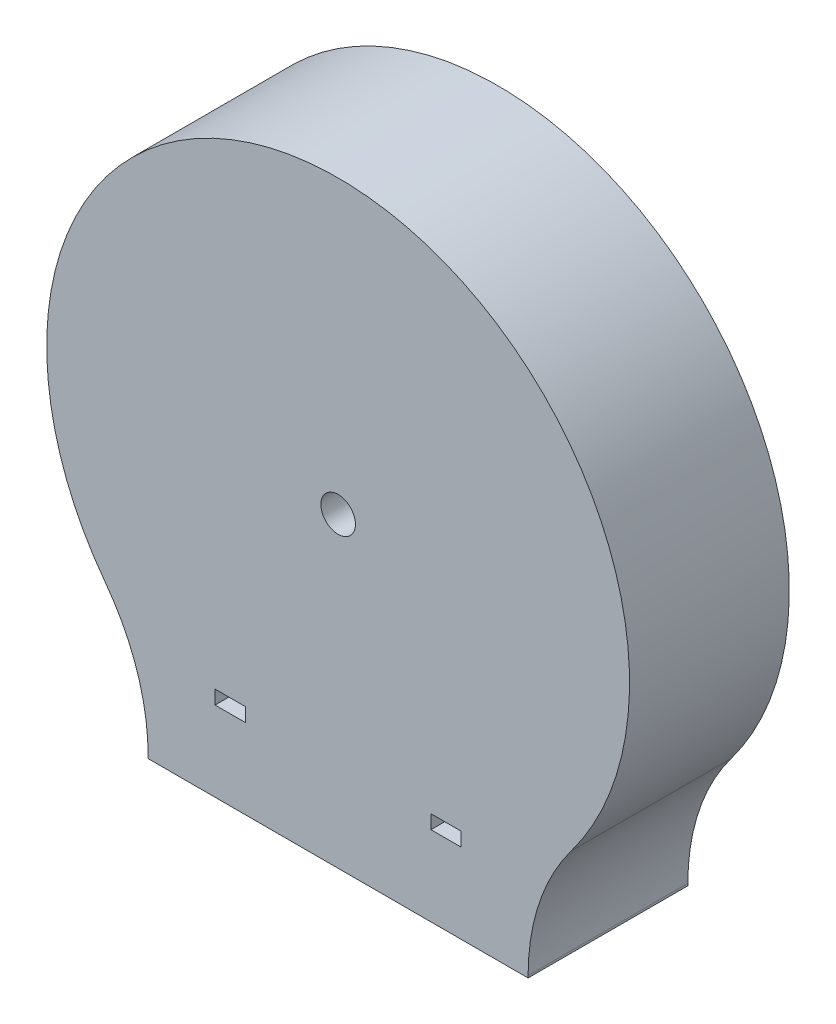
ISO-10303-21;
HEADER;
FILE_DESCRIPTION(('STEP AP214'),'2;1');
FILE_NAME('part.step','',(''),(''),'','','');
FILE_SCHEMA(('AUTOMOTIVE_DESIGN { 1 0 10303 214 1 1 1 1 }'));
ENDSEC;
DATA;
#1=APPLICATION_CONTEXT('core data for automotive mechanical design processes');
#2=APPLICATION_PROTOCOL_DEFINITION('international standard','automotive_design',2000,#1);
#3=PRODUCT_CONTEXT('',#1,'mechanical');
#4=PRODUCT('Part','Part','',(#3));
#5=PRODUCT_RELATED_PRODUCT_CATEGORY('part','',(#4));
#6=PRODUCT_DEFINITION_FORMATION('','',#4);
#7=PRODUCT_DEFINITION_CONTEXT('part definition',#1,'design');
#8=PRODUCT_DEFINITION('design','',#6,#7);
#9=PRODUCT_DEFINITION_SHAPE('','',#8);
#10=(LENGTH_UNIT() NAMED_UNIT(*) SI_UNIT(.MILLI.,.METRE.));
#11=(NAMED_UNIT(*) PLANE_ANGLE_UNIT() SI_UNIT($,.RADIAN.));
#12=(NAMED_UNIT(*) SI_UNIT($,.STERADIAN.) SOLID_ANGLE_UNIT());
#13=UNCERTAINTY_MEASURE_WITH_UNIT(LENGTH_MEASURE(1.E-05),#10,'distance_accuracy_value','');
#14=(GEOMETRIC_REPRESENTATION_CONTEXT(3) GLOBAL_UNCERTAINTY_ASSIGNED_CONTEXT((#13)) GLOBAL_UNIT_ASSIGNED_CONTEXT((#10,
#11,#12)) REPRESENTATION_CONTEXT('',''));
#15=CARTESIAN_POINT('',(0.,0.,0.));
#16=DIRECTION('',(0.,0.,1.));
#17=DIRECTION('',(1.,0.,0.));
#18=AXIS2_PLACEMENT_3D('',#15,#16,#17);
#19=CARTESIAN_POINT('',(-44.,-51.1883775871047,-37.));
#20=DIRECTION('',(-1.,0.,0.));
#21=DIRECTION('',(0.,0.,1.));
#22=AXIS2_PLACEMENT_3D('',#19,#20,#21);
#23=PLANE('',#22);
#24=DIRECTION('',(0.,-1.,0.));
#25=VECTOR('',#24,1.);
#26=CARTESIAN_POINT('',(-44.,-51.1883775871047,0.));
#27=LINE('',#26,#25);
#28=CARTESIAN_POINT('',(-44.,-70.5,0.));
#29=VERTEX_POINT('',#28);
#30=CARTESIAN_POINT('',(-44.,-71.,0.));
#31=VERTEX_POINT('',#30);
#32=EDGE_CURVE('E266',#29,#31,#27,.T.);
#33=ORIENTED_EDGE('',*,*,#32,.F.);
#34=DIRECTION('',(0.,0.,-1.));
#35=VECTOR('',#34,1.);
#36=CARTESIAN_POINT('',(-44.,-70.5,-37.));
#37=LINE('',#36,#35);
#38=CARTESIAN_POINT('',(-44.,-70.5,-37.));
#39=VERTEX_POINT('',#38);
#40=EDGE_CURVE('E298',#29,#39,#37,.T.);
#41=ORIENTED_EDGE('',*,*,#40,.T.);
#42=DIRECTION('',(0.,-1.,0.));
#43=VECTOR('',#42,1.);
#44=CARTESIAN_POINT('',(-44.,-51.1883775871047,-37.));
#45=LINE('',#44,#43);
#46=CARTESIAN_POINT('',(-44.,-71.,-37.));
#47=VERTEX_POINT('',#46);
#48=EDGE_CURVE('E267',#39,#47,#45,.T.);
#49=ORIENTED_EDGE('',*,*,#48,.T.);
#50=DIRECTION('',(0.,0.,1.));
#51=VECTOR('',#50,1.);
#52=CARTESIAN_POINT('',(-44.,-71.,-37.));
#53=LINE('',#52,#51);
#54=EDGE_CURVE('E279',#47,#31,#53,.T.);
#55=ORIENTED_EDGE('',*,*,#54,.T.);
#56=EDGE_LOOP('',(#33,#41,#49,#55));
#57=FACE_BOUND('',#56,.T.);
#58=ADVANCED_FACE('F17',(#57),#23,.T.);
#59=CARTESIAN_POINT('',(0.,0.,-37.));
#60=DIRECTION('',(0.,0.,1.));
#61=DIRECTION('',(1.,0.,0.));
#62=AXIS2_PLACEMENT_3D('',#59,#60,#61);
#63=CYLINDRICAL_SURFACE('',#62,67.5);
#64=CARTESIAN_POINT('',(0.,0.,-37.));
#65=DIRECTION('',(0.,0.,1.));
#66=DIRECTION('',(1.,0.,0.));
#67=AXIS2_PLACEMENT_3D('',#64,#65,#66);
#68=CIRCLE('',#67,67.5);
#69=CARTESIAN_POINT('',(54.,-40.5,-37.));
#70=VERTEX_POINT('',#69);
#71=CARTESIAN_POINT('',(-54.,-40.5,-37.));
#72=VERTEX_POINT('',#71);
#73=EDGE_CURVE('E276',#70,#72,#68,.T.);
#74=ORIENTED_EDGE('',*,*,#73,.T.);
#75=DIRECTION('',(0.,0.,1.));
#76=VECTOR('',#75,1.);
#77=CARTESIAN_POINT('',(-54.,-40.5,-37.));
#78=LINE('',#77,#76);
#79=CARTESIAN_POINT('',(-54.,-40.5,0.));
#80=VERTEX_POINT('',#79);
#81=EDGE_CURVE('E295',#72,#80,#78,.T.);
#82=ORIENTED_EDGE('',*,*,#81,.T.);
#83=CARTESIAN_POINT('',(0.,0.,0.));
#84=DIRECTION('',(0.,0.,1.));
#85=DIRECTION('',(1.,0.,0.));
#86=AXIS2_PLACEMENT_3D('',#83,#84,#85);
#87=CIRCLE('',#86,67.5);
#88=CARTESIAN_POINT('',(54.,-40.5,0.));
#89=VERTEX_POINT('',#88);
#90=EDGE_CURVE('E270',#89,#80,#87,.T.);
#91=ORIENTED_EDGE('',*,*,#90,.F.);
#92=DIRECTION('',(0.,0.,1.));
#93=VECTOR('',#92,1.);
#94=CARTESIAN_POINT('',(54.,-40.5,-37.));
#95=LINE('',#94,#93);
#96=EDGE_CURVE('E291',#89,#70,#95,.F.);
#97=ORIENTED_EDGE('',*,*,#96,.T.);
#98=EDGE_LOOP('',(#74,#82,#91,#97));
#99=FACE_BOUND('',#98,.T.);
#100=ADVANCED_FACE('F347',(#99),#63,.T.);
#101=CARTESIAN_POINT('',(44.,-71.,-37.));
#102=DIRECTION('',(1.,0.,0.));
#103=DIRECTION('',(0.,0.,-1.));
#104=AXIS2_PLACEMENT_3D('',#101,#102,#103);
#105=PLANE('',#104);
#106=DIRECTION('',(0.,1.,0.));
#107=VECTOR('',#106,1.);
#108=CARTESIAN_POINT('',(44.,-71.,-37.));
#109=LINE('',#108,#107);
#110=CARTESIAN_POINT('',(44.,-71.,-37.));
#111=VERTEX_POINT('',#110);
#112=CARTESIAN_POINT('',(44.,-70.5,-37.));
#113=VERTEX_POINT('',#112);
#114=EDGE_CURVE('E273',#111,#113,#109,.T.);
#115=ORIENTED_EDGE('',*,*,#114,.T.);
#116=DIRECTION('',(0.,0.,-1.));
#117=VECTOR('',#116,1.);
#118=CARTESIAN_POINT('',(44.,-70.5,0.));
#119=LINE('',#118,#117);
#120=CARTESIAN_POINT('',(44.,-70.5,0.));
#121=VERTEX_POINT('',#120);
#122=EDGE_CURVE('E300',#113,#121,#119,.F.);
#123=ORIENTED_EDGE('',*,*,#122,.T.);
#124=DIRECTION('',(0.,1.,0.));
#125=VECTOR('',#124,1.);
#126=CARTESIAN_POINT('',(44.,-71.,0.));
#127=LINE('',#126,#125);
#128=CARTESIAN_POINT('',(44.,-71.,0.));
#129=VERTEX_POINT('',#128);
#130=EDGE_CURVE('E284',#129,#121,#127,.T.);
#131=ORIENTED_EDGE('',*,*,#130,.F.);
#132=DIRECTION('',(0.,0.,1.));
#133=VECTOR('',#132,1.);
#134=CARTESIAN_POINT('',(44.,-71.,-37.));
#135=LINE('',#134,#133);
#136=EDGE_CURVE('E289',#111,#129,#135,.T.);
#137=ORIENTED_EDGE('',*,*,#136,.F.);
#138=EDGE_LOOP('',(#115,#123,#131,#137));
#139=FACE_BOUND('',#138,.T.);
#140=ADVANCED_FACE('F354',(#139),#105,.T.);
#141=CARTESIAN_POINT('',(-44.,-71.,-37.));
#142=DIRECTION('',(0.,-1.,0.));
#143=DIRECTION('',(1.,0.,0.));
#144=AXIS2_PLACEMENT_3D('',#141,#142,#143);
#145=PLANE('',#144);
#146=CARTESIAN_POINT('',(25.,-71.,-18.5));
#147=DIRECTION('',(0.,-1.,0.));
#148=DIRECTION('',(1.,0.,0.));
#149=AXIS2_PLACEMENT_3D('',#146,#147,#148);
#150=CIRCLE('',#149,2.35);
#151=CARTESIAN_POINT('',(27.35,-71.,-18.5));
#152=VERTEX_POINT('',#151);
#153=EDGE_CURVE('E227',#152,#152,#150,.T.);
#154=ORIENTED_EDGE('',*,*,#153,.F.);
#155=EDGE_LOOP('',(#154));
#156=FACE_BOUND('',#155,.T.);
#157=CARTESIAN_POINT('',(-25.,-71.,-18.5));
#158=DIRECTION('',(0.,-1.,0.));
#159=DIRECTION('',(1.,0.,0.));
#160=AXIS2_PLACEMENT_3D('',#157,#158,#159);
#161=CIRCLE('',#160,2.35);
#162=CARTESIAN_POINT('',(-22.65,-71.,-18.5));
#163=VERTEX_POINT('',#162);
#164=EDGE_CURVE('E234',#163,#163,#161,.T.);
#165=ORIENTED_EDGE('',*,*,#164,.F.);
#166=EDGE_LOOP('',(#165));
#167=FACE_BOUND('',#166,.T.);
#168=DIRECTION('',(1.,0.,0.));
#169=VECTOR('',#168,1.);
#170=CARTESIAN_POINT('',(-44.,-71.,0.));
#171=LINE('',#170,#169);
#172=EDGE_CURVE('E281',#31,#129,#171,.T.);
#173=ORIENTED_EDGE('',*,*,#172,.F.);
#174=ORIENTED_EDGE('',*,*,#54,.F.);
#175=DIRECTION('',(1.,0.,0.));
#176=VECTOR('',#175,1.);
#177=CARTESIAN_POINT('',(-44.,-71.,-37.));
#178=LINE('',#177,#176);
#179=EDGE_CURVE('E269',#47,#111,#178,.T.);
#180=ORIENTED_EDGE('',*,*,#179,.T.);
#181=ORIENTED_EDGE('',*,*,#136,.T.);
#182=EDGE_LOOP('',(#173,#174,#180,#181));
#183=FACE_BOUND('',#182,.T.);
#184=ADVANCED_FACE('F359',(#156,#167,#183),#145,.T.);
#185=CARTESIAN_POINT('',(0.,0.,-37.));
#186=DIRECTION('',(0.,0.,1.));
#187=DIRECTION('',(1.,0.,0.));
#188=AXIS2_PLACEMENT_3D('',#185,#186,#187);
#189=PLANE('',#188);
#190=CARTESIAN_POINT('',(-26.7342042148256,15.435,-37.));
#191=DIRECTION('',(0.,0.,-1.));
#192=DIRECTION('',(-1.,0.,0.));
#193=AXIS2_PLACEMENT_3D('',#190,#191,#192);
#194=CIRCLE('',#193,3.99999999999999);
#195=CARTESIAN_POINT('',(-30.7342042148256,15.435,-37.));
#196=VERTEX_POINT('',#195);
#197=EDGE_CURVE('E182',#196,#196,#194,.T.);
#198=ORIENTED_EDGE('',*,*,#197,.F.);
#199=EDGE_LOOP('',(#198));
#200=FACE_BOUND('',#199,.T.);
#201=CARTESIAN_POINT('',(-26.7342042148256,-15.435,-37.));
#202=DIRECTION('',(0.,0.,-1.));
#203=DIRECTION('',(-1.,0.,0.));
#204=AXIS2_PLACEMENT_3D('',#201,#202,#203);
#205=CIRCLE('',#204,4.);
#206=CARTESIAN_POINT('',(-30.7342042148256,-15.435,-37.));
#207=VERTEX_POINT('',#206);
#208=EDGE_CURVE('E198',#207,#207,#205,.T.);
#209=ORIENTED_EDGE('',*,*,#208,.F.);
#210=EDGE_LOOP('',(#209));
#211=FACE_BOUND('',#210,.T.);
#212=CARTESIAN_POINT('',(0.,-30.87,-37.));
#213=DIRECTION('',(0.,0.,-1.));
#214=DIRECTION('',(-1.,0.,0.));
#215=AXIS2_PLACEMENT_3D('',#212,#213,#214);
#216=CIRCLE('',#215,4.);
#217=CARTESIAN_POINT('',(-4.,-30.87,-37.));
#218=VERTEX_POINT('',#217);
#219=EDGE_CURVE('E192',#218,#218,#216,.T.);
#220=ORIENTED_EDGE('',*,*,#219,.F.);
#221=EDGE_LOOP('',(#220));
#222=FACE_BOUND('',#221,.T.);
#223=CARTESIAN_POINT('',(26.7342042148256,-15.435,-37.));
#224=DIRECTION('',(0.,0.,-1.));
#225=DIRECTION('',(-1.,0.,0.));
#226=AXIS2_PLACEMENT_3D('',#223,#224,#225);
#227=CIRCLE('',#226,4.);
#228=CARTESIAN_POINT('',(22.7342042148256,-15.435,-37.));
#229=VERTEX_POINT('',#228);
#230=EDGE_CURVE('E191',#229,#229,#227,.T.);
#231=ORIENTED_EDGE('',*,*,#230,.F.);
#232=EDGE_LOOP('',(#231));
#233=FACE_BOUND('',#232,.T.);
#234=CARTESIAN_POINT('',(26.7342042148256,15.435,-37.));
#235=DIRECTION('',(0.,0.,-1.));
#236=DIRECTION('',(-1.,0.,0.));
#237=AXIS2_PLACEMENT_3D('',#234,#235,#236);
#238=CIRCLE('',#237,4.);
#239=CARTESIAN_POINT('',(22.7342042148256,15.435,-37.));
#240=VERTEX_POINT('',#239);
#241=EDGE_CURVE('E216',#240,#240,#238,.T.);
#242=ORIENTED_EDGE('',*,*,#241,.F.);
#243=EDGE_LOOP('',(#242));
#244=FACE_BOUND('',#243,.T.);
#245=CARTESIAN_POINT('',(0.,30.87,-37.));
#246=DIRECTION('',(0.,0.,-1.));
#247=DIRECTION('',(-1.,0.,0.));
#248=AXIS2_PLACEMENT_3D('',#245,#246,#247);
#249=CIRCLE('',#248,4.);
#250=CARTESIAN_POINT('',(-4.,30.87,-37.));
#251=VERTEX_POINT('',#250);
#252=EDGE_CURVE('E210',#251,#251,#249,.T.);
#253=ORIENTED_EDGE('',*,*,#252,.F.);
#254=EDGE_LOOP('',(#253));
#255=FACE_BOUND('',#254,.T.);
#256=CARTESIAN_POINT('',(0.,0.,-37.));
#257=DIRECTION('',(0.,0.,-1.));
#258=DIRECTION('',(-1.,0.,0.));
#259=AXIS2_PLACEMENT_3D('',#256,#257,#258);
#260=CIRCLE('',#259,4.);
#261=CARTESIAN_POINT('',(-4.,0.,-37.));
#262=VERTEX_POINT('',#261);
#263=EDGE_CURVE('E228',#262,#262,#260,.T.);
#264=ORIENTED_EDGE('',*,*,#263,.F.);
#265=EDGE_LOOP('',(#264));
#266=FACE_BOUND('',#265,.T.);
#267=ORIENTED_EDGE('',*,*,#48,.F.);
#268=CARTESIAN_POINT('',(-94.,-70.5,-37.));
#269=DIRECTION('',(0.,0.,1.));
#270=DIRECTION('',(1.,0.,0.));
#271=AXIS2_PLACEMENT_3D('',#268,#269,#270);
#272=CIRCLE('',#271,50.);
#273=EDGE_CURVE('E305',#39,#72,#272,.T.);
#274=ORIENTED_EDGE('',*,*,#273,.T.);
#275=ORIENTED_EDGE('',*,*,#73,.F.);
#276=CARTESIAN_POINT('',(94.,-70.5,-37.));
#277=DIRECTION('',(0.,0.,1.));
#278=DIRECTION('',(1.,0.,0.));
#279=AXIS2_PLACEMENT_3D('',#276,#277,#278);
#280=CIRCLE('',#279,50.);
#281=EDGE_CURVE('E11',#70,#113,#280,.T.);
#282=ORIENTED_EDGE('',*,*,#281,.T.);
#283=ORIENTED_EDGE('',*,*,#114,.F.);
#284=ORIENTED_EDGE('',*,*,#179,.F.);
#285=EDGE_LOOP('',(#267,#274,#275,#282,#283,#284));
#286=FACE_BOUND('',#285,.T.);
#287=ADVANCED_FACE('F372',(#200,#211,#222,#233,#244,#255,#266,#286),#189,.F.);
#288=CARTESIAN_POINT('',(0.,0.,0.));
#289=DIRECTION('',(0.,0.,1.));
#290=DIRECTION('',(1.,0.,0.));
#291=AXIS2_PLACEMENT_3D('',#288,#289,#290);
#292=PLANE('',#291);
#293=DIRECTION('',(0.,-1.,0.));
#294=VECTOR('',#293,1.);
#295=CARTESIAN_POINT('',(21.5,-52.5,0.));
#296=LINE('',#295,#294);
#297=CARTESIAN_POINT('',(21.5,-49.3,0.));
#298=VERTEX_POINT('',#297);
#299=CARTESIAN_POINT('',(21.5,-52.5,0.));
#300=VERTEX_POINT('',#299);
#301=EDGE_CURVE('E34',#298,#300,#296,.T.);
#302=ORIENTED_EDGE('',*,*,#301,.F.);
#303=DIRECTION('',(-1.,0.,0.));
#304=VECTOR('',#303,1.);
#305=CARTESIAN_POINT('',(21.5,-49.3,0.));
#306=LINE('',#305,#304);
#307=CARTESIAN_POINT('',(28.5,-49.3,0.));
#308=VERTEX_POINT('',#307);
#309=EDGE_CURVE('E139',#308,#298,#306,.T.);
#310=ORIENTED_EDGE('',*,*,#309,.F.);
#311=DIRECTION('',(0.,1.,0.));
#312=VECTOR('',#311,1.);
#313=CARTESIAN_POINT('',(28.5,-52.5,0.));
#314=LINE('',#313,#312);
#315=CARTESIAN_POINT('',(28.5,-52.5,0.));
#316=VERTEX_POINT('',#315);
#317=EDGE_CURVE('E142',#316,#308,#314,.T.);
#318=ORIENTED_EDGE('',*,*,#317,.F.);
#319=DIRECTION('',(1.,0.,0.));
#320=VECTOR('',#319,1.);
#321=CARTESIAN_POINT('',(21.5,-52.5,0.));
#322=LINE('',#321,#320);
#323=EDGE_CURVE('E148',#300,#316,#322,.T.);
#324=ORIENTED_EDGE('',*,*,#323,.F.);
#325=EDGE_LOOP('',(#302,#310,#318,#324));
#326=FACE_BOUND('',#325,.T.);
#327=DIRECTION('',(0.,-1.,0.));
#328=VECTOR('',#327,1.);
#329=CARTESIAN_POINT('',(-28.5,-52.5,0.));
#330=LINE('',#329,#328);
#331=CARTESIAN_POINT('',(-28.5,-49.3,0.));
#332=VERTEX_POINT('',#331);
#333=CARTESIAN_POINT('',(-28.5,-52.5,0.));
#334=VERTEX_POINT('',#333);
#335=EDGE_CURVE('E42',#332,#334,#330,.T.);
#336=ORIENTED_EDGE('',*,*,#335,.F.);
#337=DIRECTION('',(-1.,0.,0.));
#338=VECTOR('',#337,1.);
#339=CARTESIAN_POINT('',(-28.5,-49.3,0.));
#340=LINE('',#339,#338);
#341=CARTESIAN_POINT('',(-21.5,-49.3,0.));
#342=VERTEX_POINT('',#341);
#343=EDGE_CURVE('E161',#342,#332,#340,.T.);
#344=ORIENTED_EDGE('',*,*,#343,.F.);
#345=DIRECTION('',(0.,1.,0.));
#346=VECTOR('',#345,1.);
#347=CARTESIAN_POINT('',(-21.5,-52.5,0.));
#348=LINE('',#347,#346);
#349=CARTESIAN_POINT('',(-21.5,-52.5,0.));
#350=VERTEX_POINT('',#349);
#351=EDGE_CURVE('E175',#350,#342,#348,.T.);
#352=ORIENTED_EDGE('',*,*,#351,.F.);
#353=DIRECTION('',(1.,0.,0.));
#354=VECTOR('',#353,1.);
#355=CARTESIAN_POINT('',(-28.5,-52.5,0.));
#356=LINE('',#355,#354);
#357=EDGE_CURVE('E172',#334,#350,#356,.T.);
#358=ORIENTED_EDGE('',*,*,#357,.F.);
#359=EDGE_LOOP('',(#336,#344,#352,#358));
#360=FACE_BOUND('',#359,.T.);
#361=CARTESIAN_POINT('',(0.,0.,0.));
#362=DIRECTION('',(0.,0.,1.));
#363=DIRECTION('',(1.,0.,0.));
#364=AXIS2_PLACEMENT_3D('',#361,#362,#363);
#365=CIRCLE('',#364,4.);
#366=CARTESIAN_POINT('',(4.,0.,0.));
#367=VERTEX_POINT('',#366);
#368=EDGE_CURVE('E240',#367,#367,#365,.T.);
#369=ORIENTED_EDGE('',*,*,#368,.F.);
#370=EDGE_LOOP('',(#369));
#371=FACE_BOUND('',#370,.T.);
#372=ORIENTED_EDGE('',*,*,#90,.T.);
#373=CARTESIAN_POINT('',(-94.,-70.5,0.));
#374=DIRECTION('',(0.,0.,1.));
#375=DIRECTION('',(1.,0.,0.));
#376=AXIS2_PLACEMENT_3D('',#373,#374,#375);
#377=CIRCLE('',#376,50.);
#378=EDGE_CURVE('E303',#80,#29,#377,.F.);
#379=ORIENTED_EDGE('',*,*,#378,.T.);
#380=ORIENTED_EDGE('',*,*,#32,.T.);
#381=ORIENTED_EDGE('',*,*,#172,.T.);
#382=ORIENTED_EDGE('',*,*,#130,.T.);
#383=CARTESIAN_POINT('',(94.,-70.5,0.));
#384=DIRECTION('',(0.,0.,1.));
#385=DIRECTION('',(1.,0.,0.));
#386=AXIS2_PLACEMENT_3D('',#383,#384,#385);
#387=CIRCLE('',#386,50.);
#388=EDGE_CURVE('E26',#121,#89,#387,.F.);
#389=ORIENTED_EDGE('',*,*,#388,.T.);
#390=EDGE_LOOP('',(#372,#379,#380,#381,#382,#389));
#391=FACE_BOUND('',#390,.T.);
#392=ADVANCED_FACE('F363',(#326,#360,#371,#391),#292,.T.);
#393=CARTESIAN_POINT('',(-94.,-70.5,-37.));
#394=DIRECTION('',(0.,0.,1.));
#395=DIRECTION('',(1.,0.,0.));
#396=AXIS2_PLACEMENT_3D('',#393,#394,#395);
#397=CYLINDRICAL_SURFACE('',#396,50.);
#398=ORIENTED_EDGE('',*,*,#273,.F.);
#399=ORIENTED_EDGE('',*,*,#40,.F.);
#400=ORIENTED_EDGE('',*,*,#378,.F.);
#401=ORIENTED_EDGE('',*,*,#81,.F.);
#402=EDGE_LOOP('',(#398,#399,#400,#401));
#403=FACE_BOUND('',#402,.T.);
#404=ADVANCED_FACE('F361',(#403),#397,.F.);
#405=CARTESIAN_POINT('',(94.,-70.5,-37.));
#406=DIRECTION('',(0.,0.,1.));
#407=DIRECTION('',(1.,0.,0.));
#408=AXIS2_PLACEMENT_3D('',#405,#406,#407);
#409=CYLINDRICAL_SURFACE('',#408,50.);
#410=ORIENTED_EDGE('',*,*,#281,.F.);
#411=ORIENTED_EDGE('',*,*,#96,.F.);
#412=ORIENTED_EDGE('',*,*,#388,.F.);
#413=ORIENTED_EDGE('',*,*,#122,.F.);
#414=EDGE_LOOP('',(#410,#411,#412,#413));
#415=FACE_BOUND('',#414,.T.);
#416=ADVANCED_FACE('F19',(#415),#409,.F.);
#417=CARTESIAN_POINT('',(0.,0.,-13.5));
#418=DIRECTION('',(0.,0.,1.));
#419=DIRECTION('',(1.,0.,0.));
#420=AXIS2_PLACEMENT_3D('',#417,#418,#419);
#421=CYLINDRICAL_SURFACE('',#420,4.);
#422=CARTESIAN_POINT('',(0.,0.,-13.5));
#423=DIRECTION('',(0.,0.,1.));
#424=DIRECTION('',(1.,0.,0.));
#425=AXIS2_PLACEMENT_3D('',#422,#423,#424);
#426=CIRCLE('',#425,4.);
#427=CARTESIAN_POINT('',(4.,0.,-13.5));
#428=VERTEX_POINT('',#427);
#429=EDGE_CURVE('E243',#428,#428,#426,.T.);
#430=ORIENTED_EDGE('',*,*,#429,.F.);
#431=EDGE_LOOP('',(#430));
#432=FACE_BOUND('',#431,.T.);
#433=ORIENTED_EDGE('',*,*,#368,.T.);
#434=EDGE_LOOP('',(#433));
#435=FACE_BOUND('',#434,.T.);
#436=ADVANCED_FACE('F370',(#432,#435),#421,.F.);
#437=CARTESIAN_POINT('',(0.,0.,-13.5));
#438=DIRECTION('',(0.,0.,1.));
#439=DIRECTION('',(1.,0.,0.));
#440=AXIS2_PLACEMENT_3D('',#437,#438,#439);
#441=PLANE('',#440);
#442=ORIENTED_EDGE('',*,*,#429,.T.);
#443=EDGE_LOOP('',(#442));
#444=FACE_BOUND('',#443,.T.);
#445=ADVANCED_FACE('F408',(#444),#441,.T.);
#446=CARTESIAN_POINT('',(-25.,-39.6,-18.5));
#447=DIRECTION('',(0.,-1.,0.));
#448=DIRECTION('',(1.,0.,0.));
#449=AXIS2_PLACEMENT_3D('',#446,#447,#448);
#450=CYLINDRICAL_SURFACE('',#449,2.35);
#451=CARTESIAN_POINT('',(-25.,-39.6,-18.5));
#452=DIRECTION('',(0.,-1.,0.));
#453=DIRECTION('',(1.,0.,0.));
#454=AXIS2_PLACEMENT_3D('',#451,#452,#453);
#455=CIRCLE('',#454,2.35);
#456=CARTESIAN_POINT('',(-22.65,-39.6,-18.5));
#457=VERTEX_POINT('',#456);
#458=EDGE_CURVE('E237',#457,#457,#455,.T.);
#459=ORIENTED_EDGE('',*,*,#458,.F.);
#460=EDGE_LOOP('',(#459));
#461=FACE_BOUND('',#460,.T.);
#462=ORIENTED_EDGE('',*,*,#164,.T.);
#463=EDGE_LOOP('',(#462));
#464=FACE_BOUND('',#463,.T.);
#465=ADVANCED_FACE('F405',(#461,#464),#450,.F.);
#466=CARTESIAN_POINT('',(-25.,-39.6,-18.5));
#467=DIRECTION('',(0.,-1.,0.));
#468=DIRECTION('',(1.,0.,0.));
#469=AXIS2_PLACEMENT_3D('',#466,#467,#468);
#470=PLANE('',#469);
#471=ORIENTED_EDGE('',*,*,#458,.T.);
#472=EDGE_LOOP('',(#471));
#473=FACE_BOUND('',#472,.T.);
#474=ADVANCED_FACE('F407',(#473),#470,.T.);
#475=CARTESIAN_POINT('',(25.,-39.6,-18.5));
#476=DIRECTION('',(0.,-1.,0.));
#477=DIRECTION('',(1.,0.,0.));
#478=AXIS2_PLACEMENT_3D('',#475,#476,#477);
#479=CYLINDRICAL_SURFACE('',#478,2.35);
#480=CARTESIAN_POINT('',(25.,-39.6,-18.5));
#481=DIRECTION('',(0.,-1.,0.));
#482=DIRECTION('',(1.,0.,0.));
#483=AXIS2_PLACEMENT_3D('',#480,#481,#482);
#484=CIRCLE('',#483,2.35);
#485=CARTESIAN_POINT('',(27.35,-39.6,-18.5));
#486=VERTEX_POINT('',#485);
#487=EDGE_CURVE('E231',#486,#486,#484,.T.);
#488=ORIENTED_EDGE('',*,*,#487,.F.);
#489=EDGE_LOOP('',(#488));
#490=FACE_BOUND('',#489,.T.);
#491=ORIENTED_EDGE('',*,*,#153,.T.);
#492=EDGE_LOOP('',(#491));
#493=FACE_BOUND('',#492,.T.);
#494=ADVANCED_FACE('F416',(#490,#493),#479,.F.);
#495=CARTESIAN_POINT('',(25.,-39.6,-18.5));
#496=DIRECTION('',(0.,-1.,0.));
#497=DIRECTION('',(1.,0.,0.));
#498=AXIS2_PLACEMENT_3D('',#495,#496,#497);
#499=PLANE('',#498);
#500=ORIENTED_EDGE('',*,*,#487,.T.);
#501=EDGE_LOOP('',(#500));
#502=FACE_BOUND('',#501,.T.);
#503=ADVANCED_FACE('F531',(#502),#499,.T.);
#504=CARTESIAN_POINT('',(0.,0.,-17.));
#505=DIRECTION('',(0.,0.,-1.));
#506=DIRECTION('',(-1.,0.,0.));
#507=AXIS2_PLACEMENT_3D('',#504,#505,#506);
#508=CYLINDRICAL_SURFACE('',#507,4.);
#509=CARTESIAN_POINT('',(0.,0.,-17.));
#510=DIRECTION('',(0.,0.,-1.));
#511=DIRECTION('',(-1.,0.,0.));
#512=AXIS2_PLACEMENT_3D('',#509,#510,#511);
#513=CIRCLE('',#512,4.);
#514=CARTESIAN_POINT('',(-4.,0.,-17.));
#515=VERTEX_POINT('',#514);
#516=EDGE_CURVE('E224',#515,#515,#513,.T.);
#517=ORIENTED_EDGE('',*,*,#516,.F.);
#518=EDGE_LOOP('',(#517));
#519=FACE_BOUND('',#518,.T.);
#520=ORIENTED_EDGE('',*,*,#263,.T.);
#521=EDGE_LOOP('',(#520));
#522=FACE_BOUND('',#521,.T.);
#523=ADVANCED_FACE('F527',(#519,#522),#508,.F.);
#524=CARTESIAN_POINT('',(0.,0.,-17.));
#525=DIRECTION('',(0.,0.,-1.));
#526=DIRECTION('',(-1.,0.,0.));
#527=AXIS2_PLACEMENT_3D('',#524,#525,#526);
#528=PLANE('',#527);
#529=ORIENTED_EDGE('',*,*,#516,.T.);
#530=EDGE_LOOP('',(#529));
#531=FACE_BOUND('',#530,.T.);
#532=ADVANCED_FACE('F500',(#531),#528,.T.);
#533=CARTESIAN_POINT('',(-26.7342042148256,15.435,-17.));
#534=DIRECTION('',(0.,0.,-1.));
#535=DIRECTION('',(-1.,0.,0.));
#536=AXIS2_PLACEMENT_3D('',#533,#534,#535);
#537=PLANE('',#536);
#538=CARTESIAN_POINT('',(-26.7342042148256,15.435,-17.));
#539=DIRECTION('',(0.,0.,-1.));
#540=DIRECTION('',(-1.,0.,0.));
#541=AXIS2_PLACEMENT_3D('',#538,#539,#540);
#542=CIRCLE('',#541,3.99999999999999);
#543=CARTESIAN_POINT('',(-30.7342042148256,15.435,-17.));
#544=VERTEX_POINT('',#543);
#545=EDGE_CURVE('E201',#544,#544,#542,.T.);
#546=ORIENTED_EDGE('',*,*,#545,.T.);
#547=EDGE_LOOP('',(#546));
#548=FACE_BOUND('',#547,.T.);
#549=CARTESIAN_POINT('',(-26.7342042148256,15.435,-17.));
#550=DIRECTION('',(0.,0.,-1.));
#551=DIRECTION('',(-1.,0.,0.));
#552=AXIS2_PLACEMENT_3D('',#549,#550,#551);
#553=CIRCLE('',#552,2.1);
#554=CARTESIAN_POINT('',(-28.8342042148256,15.435,-17.));
#555=VERTEX_POINT('',#554);
#556=EDGE_CURVE('E209',#555,#555,#553,.F.);
#557=ORIENTED_EDGE('',*,*,#556,.T.);
#558=EDGE_LOOP('',(#557));
#559=FACE_BOUND('',#558,.T.);
#560=ADVANCED_FACE('F496',(#548,#559),#537,.T.);
#561=CARTESIAN_POINT('',(-26.7342042148256,15.435,-17.));
#562=DIRECTION('',(0.,0.,-1.));
#563=DIRECTION('',(-1.,0.,0.));
#564=AXIS2_PLACEMENT_3D('',#561,#562,#563);
#565=CYLINDRICAL_SURFACE('',#564,3.99999999999999);
#566=ORIENTED_EDGE('',*,*,#545,.F.);
#567=EDGE_LOOP('',(#566));
#568=FACE_BOUND('',#567,.T.);
#569=ORIENTED_EDGE('',*,*,#197,.T.);
#570=EDGE_LOOP('',(#569));
#571=FACE_BOUND('',#570,.T.);
#572=ADVANCED_FACE('F499',(#568,#571),#565,.F.);
#573=CARTESIAN_POINT('',(0.,30.87,-17.));
#574=DIRECTION('',(0.,0.,-1.));
#575=DIRECTION('',(-1.,0.,0.));
#576=AXIS2_PLACEMENT_3D('',#573,#574,#575);
#577=PLANE('',#576);
#578=CARTESIAN_POINT('',(0.,30.87,-17.));
#579=DIRECTION('',(0.,0.,-1.));
#580=DIRECTION('',(-1.,0.,0.));
#581=AXIS2_PLACEMENT_3D('',#578,#579,#580);
#582=CIRCLE('',#581,4.);
#583=CARTESIAN_POINT('',(-4.,30.87,-17.));
#584=VERTEX_POINT('',#583);
#585=EDGE_CURVE('E206',#584,#584,#582,.T.);
#586=ORIENTED_EDGE('',*,*,#585,.T.);
#587=EDGE_LOOP('',(#586));
#588=FACE_BOUND('',#587,.T.);
#589=CARTESIAN_POINT('',(0.,30.87,-17.));
#590=DIRECTION('',(0.,0.,-1.));
#591=DIRECTION('',(-1.,0.,0.));
#592=AXIS2_PLACEMENT_3D('',#589,#590,#591);
#593=CIRCLE('',#592,2.1);
#594=CARTESIAN_POINT('',(-2.1,30.87,-17.));
#595=VERTEX_POINT('',#594);
#596=EDGE_CURVE('E310',#595,#595,#593,.F.);
#597=ORIENTED_EDGE('',*,*,#596,.T.);
#598=EDGE_LOOP('',(#597));
#599=FACE_BOUND('',#598,.T.);
#600=ADVANCED_FACE('F504',(#588,#599),#577,.T.);
#601=CARTESIAN_POINT('',(0.,30.87,-17.));
#602=DIRECTION('',(0.,0.,-1.));
#603=DIRECTION('',(-1.,0.,0.));
#604=AXIS2_PLACEMENT_3D('',#601,#602,#603);
#605=CYLINDRICAL_SURFACE('',#604,4.);
#606=ORIENTED_EDGE('',*,*,#585,.F.);
#607=EDGE_LOOP('',(#606));
#608=FACE_BOUND('',#607,.T.);
#609=ORIENTED_EDGE('',*,*,#252,.T.);
#610=EDGE_LOOP('',(#609));
#611=FACE_BOUND('',#610,.T.);
#612=ADVANCED_FACE('F493',(#608,#611),#605,.F.);
#613=CARTESIAN_POINT('',(-26.7342042148256,-15.435,-17.));
#614=DIRECTION('',(0.,0.,-1.));
#615=DIRECTION('',(-1.,0.,0.));
#616=AXIS2_PLACEMENT_3D('',#613,#614,#615);
#617=PLANE('',#616);
#618=CARTESIAN_POINT('',(-26.7342042148256,-15.435,-17.));
#619=DIRECTION('',(0.,0.,-1.));
#620=DIRECTION('',(-1.,0.,0.));
#621=AXIS2_PLACEMENT_3D('',#618,#619,#620);
#622=CIRCLE('',#621,4.);
#623=CARTESIAN_POINT('',(-30.7342042148256,-15.435,-17.));
#624=VERTEX_POINT('',#623);
#625=EDGE_CURVE('E195',#624,#624,#622,.T.);
#626=ORIENTED_EDGE('',*,*,#625,.T.);
#627=EDGE_LOOP('',(#626));
#628=FACE_BOUND('',#627,.T.);
#629=CARTESIAN_POINT('',(-26.7342042148256,-15.435,-17.));
#630=DIRECTION('',(0.,0.,-1.));
#631=DIRECTION('',(-1.,0.,0.));
#632=AXIS2_PLACEMENT_3D('',#629,#630,#631);
#633=CIRCLE('',#632,2.1);
#634=CARTESIAN_POINT('',(-28.8342042148256,-15.435,-17.));
#635=VERTEX_POINT('',#634);
#636=EDGE_CURVE('E313',#635,#635,#633,.F.);
#637=ORIENTED_EDGE('',*,*,#636,.T.);
#638=EDGE_LOOP('',(#637));
#639=FACE_BOUND('',#638,.T.);
#640=ADVANCED_FACE('F487',(#628,#639),#617,.T.);
#641=CARTESIAN_POINT('',(-26.7342042148256,-15.435,-17.));
#642=DIRECTION('',(0.,0.,-1.));
#643=DIRECTION('',(-1.,0.,0.));
#644=AXIS2_PLACEMENT_3D('',#641,#642,#643);
#645=CYLINDRICAL_SURFACE('',#644,4.);
#646=ORIENTED_EDGE('',*,*,#625,.F.);
#647=EDGE_LOOP('',(#646));
#648=FACE_BOUND('',#647,.T.);
#649=ORIENTED_EDGE('',*,*,#208,.T.);
#650=EDGE_LOOP('',(#649));
#651=FACE_BOUND('',#650,.T.);
#652=ADVANCED_FACE('F476',(#648,#651),#645,.F.);
#653=CARTESIAN_POINT('',(0.,-30.87,-17.));
#654=DIRECTION('',(0.,0.,-1.));
#655=DIRECTION('',(-1.,0.,0.));
#656=AXIS2_PLACEMENT_3D('',#653,#654,#655);
#657=PLANE('',#656);
#658=CARTESIAN_POINT('',(0.,-30.87,-17.));
#659=DIRECTION('',(0.,0.,-1.));
#660=DIRECTION('',(-1.,0.,0.));
#661=AXIS2_PLACEMENT_3D('',#658,#659,#660);
#662=CIRCLE('',#661,4.);
#663=CARTESIAN_POINT('',(-4.,-30.87,-17.));
#664=VERTEX_POINT('',#663);
#665=EDGE_CURVE('E188',#664,#664,#662,.T.);
#666=ORIENTED_EDGE('',*,*,#665,.T.);
#667=EDGE_LOOP('',(#666));
#668=FACE_BOUND('',#667,.T.);
#669=CARTESIAN_POINT('',(0.,-30.87,-17.));
#670=DIRECTION('',(0.,0.,-1.));
#671=DIRECTION('',(-1.,0.,0.));
#672=AXIS2_PLACEMENT_3D('',#669,#670,#671);
#673=CIRCLE('',#672,2.1);
#674=CARTESIAN_POINT('',(-2.1,-30.87,-17.));
#675=VERTEX_POINT('',#674);
#676=EDGE_CURVE('E316',#675,#675,#673,.F.);
#677=ORIENTED_EDGE('',*,*,#676,.T.);
#678=EDGE_LOOP('',(#677));
#679=FACE_BOUND('',#678,.T.);
#680=ADVANCED_FACE('F473',(#668,#679),#657,.T.);
#681=CARTESIAN_POINT('',(0.,-30.87,-17.));
#682=DIRECTION('',(0.,0.,-1.));
#683=DIRECTION('',(-1.,0.,0.));
#684=AXIS2_PLACEMENT_3D('',#681,#682,#683);
#685=CYLINDRICAL_SURFACE('',#684,4.);
#686=ORIENTED_EDGE('',*,*,#665,.F.);
#687=EDGE_LOOP('',(#686));
#688=FACE_BOUND('',#687,.T.);
#689=ORIENTED_EDGE('',*,*,#219,.T.);
#690=EDGE_LOOP('',(#689));
#691=FACE_BOUND('',#690,.T.);
#692=ADVANCED_FACE('F475',(#688,#691),#685,.F.);
#693=CARTESIAN_POINT('',(26.7342042148256,-15.435,-17.));
#694=DIRECTION('',(0.,0.,-1.));
#695=DIRECTION('',(-1.,0.,0.));
#696=AXIS2_PLACEMENT_3D('',#693,#694,#695);
#697=PLANE('',#696);
#698=CARTESIAN_POINT('',(26.7342042148256,-15.435,-17.));
#699=DIRECTION('',(0.,0.,-1.));
#700=DIRECTION('',(-1.,0.,0.));
#701=AXIS2_PLACEMENT_3D('',#698,#699,#700);
#702=CIRCLE('',#701,4.);
#703=CARTESIAN_POINT('',(22.7342042148256,-15.435,-17.));
#704=VERTEX_POINT('',#703);
#705=EDGE_CURVE('E219',#704,#704,#702,.T.);
#706=ORIENTED_EDGE('',*,*,#705,.T.);
#707=EDGE_LOOP('',(#706));
#708=FACE_BOUND('',#707,.T.);
#709=CARTESIAN_POINT('',(26.7342042148256,-15.435,-17.));
#710=DIRECTION('',(0.,0.,-1.));
#711=DIRECTION('',(-1.,0.,0.));
#712=AXIS2_PLACEMENT_3D('',#709,#710,#711);
#713=CIRCLE('',#712,2.1);
#714=CARTESIAN_POINT('',(24.6342042148256,-15.435,-17.));
#715=VERTEX_POINT('',#714);
#716=EDGE_CURVE('E318',#715,#715,#713,.F.);
#717=ORIENTED_EDGE('',*,*,#716,.T.);
#718=EDGE_LOOP('',(#717));
#719=FACE_BOUND('',#718,.T.);
#720=ADVANCED_FACE('F484',(#708,#719),#697,.T.);
#721=CARTESIAN_POINT('',(26.7342042148256,-15.435,-17.));
#722=DIRECTION('',(0.,0.,-1.));
#723=DIRECTION('',(-1.,0.,0.));
#724=AXIS2_PLACEMENT_3D('',#721,#722,#723);
#725=CYLINDRICAL_SURFACE('',#724,4.);
#726=ORIENTED_EDGE('',*,*,#705,.F.);
#727=EDGE_LOOP('',(#726));
#728=FACE_BOUND('',#727,.T.);
#729=ORIENTED_EDGE('',*,*,#230,.T.);
#730=EDGE_LOOP('',(#729));
#731=FACE_BOUND('',#730,.T.);
#732=ADVANCED_FACE('F514',(#728,#731),#725,.F.);
#733=CARTESIAN_POINT('',(26.7342042148256,15.435,-17.));
#734=DIRECTION('',(0.,0.,-1.));
#735=DIRECTION('',(-1.,0.,0.));
#736=AXIS2_PLACEMENT_3D('',#733,#734,#735);
#737=PLANE('',#736);
#738=CARTESIAN_POINT('',(26.7342042148256,15.435,-17.));
#739=DIRECTION('',(0.,0.,-1.));
#740=DIRECTION('',(-1.,0.,0.));
#741=AXIS2_PLACEMENT_3D('',#738,#739,#740);
#742=CIRCLE('',#741,4.);
#743=CARTESIAN_POINT('',(22.7342042148256,15.435,-17.));
#744=VERTEX_POINT('',#743);
#745=EDGE_CURVE('E213',#744,#744,#742,.T.);
#746=ORIENTED_EDGE('',*,*,#745,.T.);
#747=EDGE_LOOP('',(#746));
#748=FACE_BOUND('',#747,.T.);
#749=CARTESIAN_POINT('',(26.7342042148256,15.435,-17.));
#750=DIRECTION('',(0.,0.,-1.));
#751=DIRECTION('',(-1.,0.,0.));
#752=AXIS2_PLACEMENT_3D('',#749,#750,#751);
#753=CIRCLE('',#752,2.1);
#754=CARTESIAN_POINT('',(24.6342042148256,15.435,-17.));
#755=VERTEX_POINT('',#754);
#756=EDGE_CURVE('E21',#755,#755,#753,.F.);
#757=ORIENTED_EDGE('',*,*,#756,.T.);
#758=EDGE_LOOP('',(#757));
#759=FACE_BOUND('',#758,.T.);
#760=ADVANCED_FACE('F325',(#748,#759),#737,.T.);
#761=CARTESIAN_POINT('',(26.7342042148256,15.435,-17.));
#762=DIRECTION('',(0.,0.,-1.));
#763=DIRECTION('',(-1.,0.,0.));
#764=AXIS2_PLACEMENT_3D('',#761,#762,#763);
#765=CYLINDRICAL_SURFACE('',#764,4.);
#766=ORIENTED_EDGE('',*,*,#745,.F.);
#767=EDGE_LOOP('',(#766));
#768=FACE_BOUND('',#767,.T.);
#769=ORIENTED_EDGE('',*,*,#241,.T.);
#770=EDGE_LOOP('',(#769));
#771=FACE_BOUND('',#770,.T.);
#772=ADVANCED_FACE('F451',(#768,#771),#765,.F.);
#773=CARTESIAN_POINT('',(-26.7342042148256,15.435,-7.));
#774=DIRECTION('',(0.,0.,-1.));
#775=DIRECTION('',(-1.,0.,0.));
#776=AXIS2_PLACEMENT_3D('',#773,#774,#775);
#777=PLANE('',#776);
#778=CARTESIAN_POINT('',(-26.7342042148256,15.435,-7.));
#779=DIRECTION('',(0.,0.,-1.));
#780=DIRECTION('',(-1.,0.,0.));
#781=AXIS2_PLACEMENT_3D('',#778,#779,#780);
#782=CIRCLE('',#781,2.1);
#783=CARTESIAN_POINT('',(-28.8342042148256,15.435,-7.));
#784=VERTEX_POINT('',#783);
#785=EDGE_CURVE('E246',#784,#784,#782,.T.);
#786=ORIENTED_EDGE('',*,*,#785,.T.);
#787=EDGE_LOOP('',(#786));
#788=FACE_BOUND('',#787,.T.);
#789=ADVANCED_FACE('F447',(#788),#777,.T.);
#790=CARTESIAN_POINT('',(-26.7342042148256,15.435,-7.));
#791=DIRECTION('',(0.,0.,-1.));
#792=DIRECTION('',(-1.,0.,0.));
#793=AXIS2_PLACEMENT_3D('',#790,#791,#792);
#794=CYLINDRICAL_SURFACE('',#793,2.1);
#795=ORIENTED_EDGE('',*,*,#785,.F.);
#796=EDGE_LOOP('',(#795));
#797=FACE_BOUND('',#796,.T.);
#798=ORIENTED_EDGE('',*,*,#556,.F.);
#799=EDGE_LOOP('',(#798));
#800=FACE_BOUND('',#799,.T.);
#801=ADVANCED_FACE('F443',(#797,#800),#794,.F.);
#802=CARTESIAN_POINT('',(0.,0.,-7.));
#803=DIRECTION('',(0.,0.,-1.));
#804=DIRECTION('',(-1.,0.,0.));
#805=AXIS2_PLACEMENT_3D('',#802,#803,#804);
#806=PLANE('',#805);
#807=CARTESIAN_POINT('',(0.,30.87,-7.));
#808=DIRECTION('',(0.,0.,-1.));
#809=DIRECTION('',(-1.,0.,0.));
#810=AXIS2_PLACEMENT_3D('',#807,#808,#809);
#811=CIRCLE('',#810,2.1);
#812=CARTESIAN_POINT('',(-2.1,30.87,-7.));
#813=VERTEX_POINT('',#812);
#814=EDGE_CURVE('E253',#813,#813,#811,.T.);
#815=ORIENTED_EDGE('',*,*,#814,.T.);
#816=EDGE_LOOP('',(#815));
#817=FACE_BOUND('',#816,.T.);
#818=ADVANCED_FACE('F439',(#817),#806,.T.);
#819=CARTESIAN_POINT('',(0.,30.87,-7.));
#820=DIRECTION('',(0.,0.,-1.));
#821=DIRECTION('',(-1.,0.,0.));
#822=AXIS2_PLACEMENT_3D('',#819,#820,#821);
#823=CYLINDRICAL_SURFACE('',#822,2.1);
#824=ORIENTED_EDGE('',*,*,#814,.F.);
#825=EDGE_LOOP('',(#824));
#826=FACE_BOUND('',#825,.T.);
#827=ORIENTED_EDGE('',*,*,#596,.F.);
#828=EDGE_LOOP('',(#827));
#829=FACE_BOUND('',#828,.T.);
#830=ADVANCED_FACE('F435',(#826,#829),#823,.F.);
#831=CARTESIAN_POINT('',(0.,0.,-7.));
#832=DIRECTION('',(0.,0.,-1.));
#833=DIRECTION('',(-1.,0.,0.));
#834=AXIS2_PLACEMENT_3D('',#831,#832,#833);
#835=PLANE('',#834);
#836=CARTESIAN_POINT('',(-26.7342042148256,-15.435,-7.));
#837=DIRECTION('',(0.,0.,-1.));
#838=DIRECTION('',(-1.,0.,0.));
#839=AXIS2_PLACEMENT_3D('',#836,#837,#838);
#840=CIRCLE('',#839,2.1);
#841=CARTESIAN_POINT('',(-28.8342042148256,-15.435,-7.));
#842=VERTEX_POINT('',#841);
#843=EDGE_CURVE('E249',#842,#842,#840,.T.);
#844=ORIENTED_EDGE('',*,*,#843,.T.);
#845=EDGE_LOOP('',(#844));
#846=FACE_BOUND('',#845,.T.);
#847=ADVANCED_FACE('F431',(#846),#835,.T.);
#848=CARTESIAN_POINT('',(-26.7342042148256,-15.435,-7.));
#849=DIRECTION('',(0.,0.,-1.));
#850=DIRECTION('',(-1.,0.,0.));
#851=AXIS2_PLACEMENT_3D('',#848,#849,#850);
#852=CYLINDRICAL_SURFACE('',#851,2.1);
#853=ORIENTED_EDGE('',*,*,#843,.F.);
#854=EDGE_LOOP('',(#853));
#855=FACE_BOUND('',#854,.T.);
#856=ORIENTED_EDGE('',*,*,#636,.F.);
#857=EDGE_LOOP('',(#856));
#858=FACE_BOUND('',#857,.T.);
#859=ADVANCED_FACE('F427',(#855,#858),#852,.F.);
#860=CARTESIAN_POINT('',(0.,0.,-7.));
#861=DIRECTION('',(0.,0.,-1.));
#862=DIRECTION('',(-1.,0.,0.));
#863=AXIS2_PLACEMENT_3D('',#860,#861,#862);
#864=PLANE('',#863);
#865=CARTESIAN_POINT('',(0.,-30.87,-7.));
#866=DIRECTION('',(0.,0.,-1.));
#867=DIRECTION('',(-1.,0.,0.));
#868=AXIS2_PLACEMENT_3D('',#865,#866,#867);
#869=CIRCLE('',#868,2.1);
#870=CARTESIAN_POINT('',(-2.1,-30.87,-7.));
#871=VERTEX_POINT('',#870);
#872=EDGE_CURVE('E252',#871,#871,#869,.T.);
#873=ORIENTED_EDGE('',*,*,#872,.T.);
#874=EDGE_LOOP('',(#873));
#875=FACE_BOUND('',#874,.T.);
#876=ADVANCED_FACE('F430',(#875),#864,.T.);
#877=CARTESIAN_POINT('',(0.,-30.87,-7.));
#878=DIRECTION('',(0.,0.,-1.));
#879=DIRECTION('',(-1.,0.,0.));
#880=AXIS2_PLACEMENT_3D('',#877,#878,#879);
#881=CYLINDRICAL_SURFACE('',#880,2.1);
#882=ORIENTED_EDGE('',*,*,#872,.F.);
#883=EDGE_LOOP('',(#882));
#884=FACE_BOUND('',#883,.T.);
#885=ORIENTED_EDGE('',*,*,#676,.F.);
#886=EDGE_LOOP('',(#885));
#887=FACE_BOUND('',#886,.T.);
#888=ADVANCED_FACE('F459',(#884,#887),#881,.F.);
#889=CARTESIAN_POINT('',(0.,0.,-7.));
#890=DIRECTION('',(0.,0.,-1.));
#891=DIRECTION('',(-1.,0.,0.));
#892=AXIS2_PLACEMENT_3D('',#889,#890,#891);
#893=PLANE('',#892);
#894=CARTESIAN_POINT('',(26.7342042148256,-15.435,-7.));
#895=DIRECTION('',(0.,0.,-1.));
#896=DIRECTION('',(-1.,0.,0.));
#897=AXIS2_PLACEMENT_3D('',#894,#895,#896);
#898=CIRCLE('',#897,2.1);
#899=CARTESIAN_POINT('',(24.6342042148256,-15.435,-7.));
#900=VERTEX_POINT('',#899);
#901=EDGE_CURVE('E258',#900,#900,#898,.T.);
#902=ORIENTED_EDGE('',*,*,#901,.T.);
#903=EDGE_LOOP('',(#902));
#904=FACE_BOUND('',#903,.T.);
#905=ADVANCED_FACE('F455',(#904),#893,.T.);
#906=CARTESIAN_POINT('',(26.7342042148256,-15.435,-7.));
#907=DIRECTION('',(0.,0.,-1.));
#908=DIRECTION('',(-1.,0.,0.));
#909=AXIS2_PLACEMENT_3D('',#906,#907,#908);
#910=CYLINDRICAL_SURFACE('',#909,2.1);
#911=ORIENTED_EDGE('',*,*,#901,.F.);
#912=EDGE_LOOP('',(#911));
#913=FACE_BOUND('',#912,.T.);
#914=ORIENTED_EDGE('',*,*,#716,.F.);
#915=EDGE_LOOP('',(#914));
#916=FACE_BOUND('',#915,.T.);
#917=ADVANCED_FACE('F341',(#913,#916),#910,.F.);
#918=CARTESIAN_POINT('',(0.,0.,-7.));
#919=DIRECTION('',(0.,0.,-1.));
#920=DIRECTION('',(-1.,0.,0.));
#921=AXIS2_PLACEMENT_3D('',#918,#919,#920);
#922=PLANE('',#921);
#923=CARTESIAN_POINT('',(26.7342042148256,15.435,-7.));
#924=DIRECTION('',(0.,0.,-1.));
#925=DIRECTION('',(-1.,0.,0.));
#926=AXIS2_PLACEMENT_3D('',#923,#924,#925);
#927=CIRCLE('',#926,2.1);
#928=CARTESIAN_POINT('',(24.6342042148256,15.435,-7.));
#929=VERTEX_POINT('',#928);
#930=EDGE_CURVE('E261',#929,#929,#927,.T.);
#931=ORIENTED_EDGE('',*,*,#930,.T.);
#932=EDGE_LOOP('',(#931));
#933=FACE_BOUND('',#932,.T.);
#934=ADVANCED_FACE('F330',(#933),#922,.T.);
#935=CARTESIAN_POINT('',(26.7342042148256,15.435,-7.));
#936=DIRECTION('',(0.,0.,-1.));
#937=DIRECTION('',(-1.,0.,0.));
#938=AXIS2_PLACEMENT_3D('',#935,#936,#937);
#939=CYLINDRICAL_SURFACE('',#938,2.1);
#940=ORIENTED_EDGE('',*,*,#930,.F.);
#941=EDGE_LOOP('',(#940));
#942=FACE_BOUND('',#941,.T.);
#943=ORIENTED_EDGE('',*,*,#756,.F.);
#944=EDGE_LOOP('',(#943));
#945=FACE_BOUND('',#944,.T.);
#946=ADVANCED_FACE('F327',(#942,#945),#939,.F.);
#947=CARTESIAN_POINT('',(-28.5,-52.5,-15.));
#948=DIRECTION('',(-1.,0.,0.));
#949=DIRECTION('',(0.,0.,1.));
#950=AXIS2_PLACEMENT_3D('',#947,#948,#949);
#951=PLANE('',#950);
#952=ORIENTED_EDGE('',*,*,#335,.T.);
#953=DIRECTION('',(0.,0.,1.));
#954=VECTOR('',#953,1.);
#955=CARTESIAN_POINT('',(-28.5,-52.5,-15.));
#956=LINE('',#955,#954);
#957=CARTESIAN_POINT('',(-28.5,-52.5,-15.));
#958=VERTEX_POINT('',#957);
#959=EDGE_CURVE('E170',#958,#334,#956,.T.);
#960=ORIENTED_EDGE('',*,*,#959,.F.);
#961=DIRECTION('',(0.,-1.,0.));
#962=VECTOR('',#961,1.);
#963=CARTESIAN_POINT('',(-28.5,-52.5,-15.));
#964=LINE('',#963,#962);
#965=CARTESIAN_POINT('',(-28.5,-49.3,-15.));
#966=VERTEX_POINT('',#965);
#967=EDGE_CURVE('E157',#966,#958,#964,.T.);
#968=ORIENTED_EDGE('',*,*,#967,.F.);
#969=DIRECTION('',(0.,0.,1.));
#970=VECTOR('',#969,1.);
#971=CARTESIAN_POINT('',(-28.5,-49.3,-15.));
#972=LINE('',#971,#970);
#973=EDGE_CURVE('E180',#966,#332,#972,.T.);
#974=ORIENTED_EDGE('',*,*,#973,.T.);
#975=EDGE_LOOP('',(#952,#960,#968,#974));
#976=FACE_BOUND('',#975,.T.);
#977=ADVANCED_FACE('F329',(#976),#951,.F.);
#978=CARTESIAN_POINT('',(-28.5,-49.3,-15.));
#979=DIRECTION('',(0.,1.,0.));
#980=DIRECTION('',(-1.,0.,0.));
#981=AXIS2_PLACEMENT_3D('',#978,#979,#980);
#982=PLANE('',#981);
#983=ORIENTED_EDGE('',*,*,#343,.T.);
#984=ORIENTED_EDGE('',*,*,#973,.F.);
#985=DIRECTION('',(-1.,0.,0.));
#986=VECTOR('',#985,1.);
#987=CARTESIAN_POINT('',(-28.5,-49.3,-15.));
#988=LINE('',#987,#986);
#989=CARTESIAN_POINT('',(-21.5,-49.3,-15.));
#990=VERTEX_POINT('',#989);
#991=EDGE_CURVE('E167',#990,#966,#988,.T.);
#992=ORIENTED_EDGE('',*,*,#991,.F.);
#993=DIRECTION('',(0.,0.,1.));
#994=VECTOR('',#993,1.);
#995=CARTESIAN_POINT('',(-21.5,-49.3,-15.));
#996=LINE('',#995,#994);
#997=EDGE_CURVE('E183',#990,#342,#996,.T.);
#998=ORIENTED_EDGE('',*,*,#997,.T.);
#999=EDGE_LOOP('',(#983,#984,#992,#998));
#1000=FACE_BOUND('',#999,.T.);
#1001=ADVANCED_FACE('F339',(#1000),#982,.F.);
#1002=CARTESIAN_POINT('',(-21.5,-52.5,-15.));
#1003=DIRECTION('',(1.,0.,0.));
#1004=DIRECTION('',(0.,0.,-1.));
#1005=AXIS2_PLACEMENT_3D('',#1002,#1003,#1004);
#1006=PLANE('',#1005);
#1007=ORIENTED_EDGE('',*,*,#351,.T.);
#1008=ORIENTED_EDGE('',*,*,#997,.F.);
#1009=DIRECTION('',(0.,1.,0.));
#1010=VECTOR('',#1009,1.);
#1011=CARTESIAN_POINT('',(-21.5,-52.5,-15.));
#1012=LINE('',#1011,#1010);
#1013=CARTESIAN_POINT('',(-21.5,-52.5,-15.));
#1014=VERTEX_POINT('',#1013);
#1015=EDGE_CURVE('E164',#1014,#990,#1012,.T.);
#1016=ORIENTED_EDGE('',*,*,#1015,.F.);
#1017=DIRECTION('',(0.,0.,1.));
#1018=VECTOR('',#1017,1.);
#1019=CARTESIAN_POINT('',(-21.5,-52.5,-15.));
#1020=LINE('',#1019,#1018);
#1021=EDGE_CURVE('E185',#1014,#350,#1020,.T.);
#1022=ORIENTED_EDGE('',*,*,#1021,.T.);
#1023=EDGE_LOOP('',(#1007,#1008,#1016,#1022));
#1024=FACE_BOUND('',#1023,.T.);
#1025=ADVANCED_FACE('F710',(#1024),#1006,.F.);
#1026=CARTESIAN_POINT('',(-28.5,-52.5,-15.));
#1027=DIRECTION('',(0.,-1.,0.));
#1028=DIRECTION('',(0.,0.,-1.));
#1029=AXIS2_PLACEMENT_3D('',#1026,#1027,#1028);
#1030=PLANE('',#1029);
#1031=ORIENTED_EDGE('',*,*,#357,.T.);
#1032=ORIENTED_EDGE('',*,*,#1021,.F.);
#1033=DIRECTION('',(1.,0.,0.));
#1034=VECTOR('',#1033,1.);
#1035=CARTESIAN_POINT('',(-28.5,-52.5,-15.));
#1036=LINE('',#1035,#1034);
#1037=EDGE_CURVE('E160',#958,#1014,#1036,.T.);
#1038=ORIENTED_EDGE('',*,*,#1037,.F.);
#1039=ORIENTED_EDGE('',*,*,#959,.T.);
#1040=EDGE_LOOP('',(#1031,#1032,#1038,#1039));
#1041=FACE_BOUND('',#1040,.T.);
#1042=ADVANCED_FACE('F720',(#1041),#1030,.F.);
#1043=CARTESIAN_POINT('',(0.,0.,-15.));
#1044=DIRECTION('',(0.,0.,-1.));
#1045=DIRECTION('',(-1.,0.,0.));
#1046=AXIS2_PLACEMENT_3D('',#1043,#1044,#1045);
#1047=PLANE('',#1046);
#1048=ORIENTED_EDGE('',*,*,#967,.T.);
#1049=ORIENTED_EDGE('',*,*,#1037,.T.);
#1050=ORIENTED_EDGE('',*,*,#1015,.T.);
#1051=ORIENTED_EDGE('',*,*,#991,.T.);
#1052=EDGE_LOOP('',(#1048,#1049,#1050,#1051));
#1053=FACE_BOUND('',#1052,.T.);
#1054=ADVANCED_FACE('F730',(#1053),#1047,.F.);
#1055=CARTESIAN_POINT('',(21.5,-52.5,-15.));
#1056=DIRECTION('',(-1.,0.,0.));
#1057=DIRECTION('',(0.,0.,1.));
#1058=AXIS2_PLACEMENT_3D('',#1055,#1056,#1057);
#1059=PLANE('',#1058);
#1060=ORIENTED_EDGE('',*,*,#301,.T.);
#1061=DIRECTION('',(0.,0.,1.));
#1062=VECTOR('',#1061,1.);
#1063=CARTESIAN_POINT('',(21.5,-52.5,-15.));
#1064=LINE('',#1063,#1062);
#1065=CARTESIAN_POINT('',(21.5,-52.5,-15.));
#1066=VERTEX_POINT('',#1065);
#1067=EDGE_CURVE('E117',#1066,#300,#1064,.T.);
#1068=ORIENTED_EDGE('',*,*,#1067,.F.);
#1069=DIRECTION('',(0.,-1.,0.));
#1070=VECTOR('',#1069,1.);
#1071=CARTESIAN_POINT('',(21.5,-52.5,-15.));
#1072=LINE('',#1071,#1070);
#1073=CARTESIAN_POINT('',(21.5,-49.3,-15.));
#1074=VERTEX_POINT('',#1073);
#1075=EDGE_CURVE('E121',#1074,#1066,#1072,.T.);
#1076=ORIENTED_EDGE('',*,*,#1075,.F.);
#1077=DIRECTION('',(0.,0.,1.));
#1078=VECTOR('',#1077,1.);
#1079=CARTESIAN_POINT('',(21.5,-49.3,-15.));
#1080=LINE('',#1079,#1078);
#1081=EDGE_CURVE('E152',#1074,#298,#1080,.T.);
#1082=ORIENTED_EDGE('',*,*,#1081,.T.);
#1083=EDGE_LOOP('',(#1060,#1068,#1076,#1082));
#1084=FACE_BOUND('',#1083,.T.);
#1085=ADVANCED_FACE('F119',(#1084),#1059,.F.);
#1086=CARTESIAN_POINT('',(21.5,-49.3,-15.));
#1087=DIRECTION('',(0.,1.,0.));
#1088=DIRECTION('',(-1.,0.,0.));
#1089=AXIS2_PLACEMENT_3D('',#1086,#1087,#1088);
#1090=PLANE('',#1089);
#1091=ORIENTED_EDGE('',*,*,#309,.T.);
#1092=ORIENTED_EDGE('',*,*,#1081,.F.);
#1093=DIRECTION('',(-1.,0.,0.));
#1094=VECTOR('',#1093,1.);
#1095=CARTESIAN_POINT('',(21.5,-49.3,-15.));
#1096=LINE('',#1095,#1094);
#1097=CARTESIAN_POINT('',(28.5,-49.3,-15.));
#1098=VERTEX_POINT('',#1097);
#1099=EDGE_CURVE('E127',#1098,#1074,#1096,.T.);
#1100=ORIENTED_EDGE('',*,*,#1099,.F.);
#1101=DIRECTION('',(0.,0.,1.));
#1102=VECTOR('',#1101,1.);
#1103=CARTESIAN_POINT('',(28.5,-49.3,-15.));
#1104=LINE('',#1103,#1102);
#1105=EDGE_CURVE('E154',#1098,#308,#1104,.T.);
#1106=ORIENTED_EDGE('',*,*,#1105,.T.);
#1107=EDGE_LOOP('',(#1091,#1092,#1100,#1106));
#1108=FACE_BOUND('',#1107,.T.);
#1109=ADVANCED_FACE('F748',(#1108),#1090,.F.);
#1110=CARTESIAN_POINT('',(28.5,-52.5,-15.));
#1111=DIRECTION('',(1.,0.,0.));
#1112=DIRECTION('',(0.,0.,-1.));
#1113=AXIS2_PLACEMENT_3D('',#1110,#1111,#1112);
#1114=PLANE('',#1113);
#1115=ORIENTED_EDGE('',*,*,#317,.T.);
#1116=ORIENTED_EDGE('',*,*,#1105,.F.);
#1117=DIRECTION('',(0.,1.,0.));
#1118=VECTOR('',#1117,1.);
#1119=CARTESIAN_POINT('',(28.5,-52.5,-15.));
#1120=LINE('',#1119,#1118);
#1121=CARTESIAN_POINT('',(28.5,-52.5,-15.));
#1122=VERTEX_POINT('',#1121);
#1123=EDGE_CURVE('E135',#1122,#1098,#1120,.T.);
#1124=ORIENTED_EDGE('',*,*,#1123,.F.);
#1125=DIRECTION('',(0.,0.,1.));
#1126=VECTOR('',#1125,1.);
#1127=CARTESIAN_POINT('',(28.5,-52.5,-15.));
#1128=LINE('',#1127,#1126);
#1129=EDGE_CURVE('E126',#1122,#316,#1128,.T.);
#1130=ORIENTED_EDGE('',*,*,#1129,.T.);
#1131=EDGE_LOOP('',(#1115,#1116,#1124,#1130));
#1132=FACE_BOUND('',#1131,.T.);
#1133=ADVANCED_FACE('F757',(#1132),#1114,.F.);
#1134=CARTESIAN_POINT('',(21.5,-52.5,-15.));
#1135=DIRECTION('',(0.,-1.,0.));
#1136=DIRECTION('',(0.,0.,-1.));
#1137=AXIS2_PLACEMENT_3D('',#1134,#1135,#1136);
#1138=PLANE('',#1137);
#1139=ORIENTED_EDGE('',*,*,#323,.T.);
#1140=ORIENTED_EDGE('',*,*,#1129,.F.);
#1141=DIRECTION('',(1.,0.,0.));
#1142=VECTOR('',#1141,1.);
#1143=CARTESIAN_POINT('',(21.5,-52.5,-15.));
#1144=LINE('',#1143,#1142);
#1145=EDGE_CURVE('E130',#1066,#1122,#1144,.T.);
#1146=ORIENTED_EDGE('',*,*,#1145,.F.);
#1147=ORIENTED_EDGE('',*,*,#1067,.T.);
#1148=EDGE_LOOP('',(#1139,#1140,#1146,#1147));
#1149=FACE_BOUND('',#1148,.T.);
#1150=ADVANCED_FACE('F131',(#1149),#1138,.F.);
#1151=CARTESIAN_POINT('',(0.,0.,-15.));
#1152=DIRECTION('',(0.,0.,-1.));
#1153=DIRECTION('',(-1.,0.,0.));
#1154=AXIS2_PLACEMENT_3D('',#1151,#1152,#1153);
#1155=PLANE('',#1154);
#1156=ORIENTED_EDGE('',*,*,#1075,.T.);
#1157=ORIENTED_EDGE('',*,*,#1145,.T.);
#1158=ORIENTED_EDGE('',*,*,#1123,.T.);
#1159=ORIENTED_EDGE('',*,*,#1099,.T.);
#1160=EDGE_LOOP('',(#1156,#1157,#1158,#1159));
#1161=FACE_BOUND('',#1160,.T.);
#1162=ADVANCED_FACE('F137',(#1161),#1155,.F.);
#1163=CLOSED_SHELL('',(#58,#100,#140,#184,#287,#392,#404,#416,#436,#445,#465,#474,#494,#503,
#523,#532,#560,#572,#600,#612,#640,#652,#680,#692,#720,#732,#760,#772,#789,#801,#818,#830,#847,
#859,#876,#888,#905,#917,#934,#946,#977,#1001,#1025,#1042,#1054,#1085,#1109,#1133,#1150,#1162));
#1164=MANIFOLD_SOLID_BREP('B1',#1163);
#1165=ADVANCED_BREP_SHAPE_REPRESENTATION('',(#18,#1164),#14);
#1166=SHAPE_DEFINITION_REPRESENTATION(#9,#1165);
ENDSEC;
END-ISO-10303-21;
